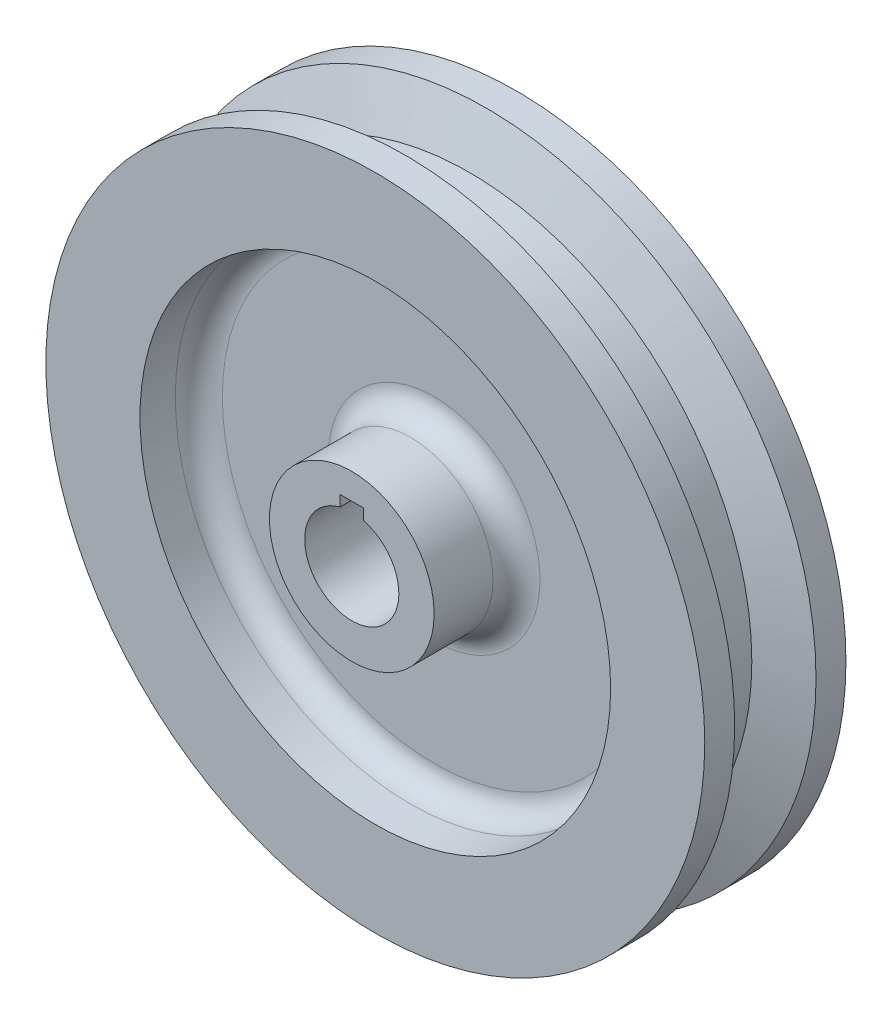
ISO-10303-21;
HEADER;
FILE_DESCRIPTION(('STEP AP214'),'2;1');
FILE_NAME('part.step','',(''),(''),'','','');
FILE_SCHEMA(('AUTOMOTIVE_DESIGN { 1 0 10303 214 1 1 1 1 }'));
ENDSEC;
DATA;
#1=APPLICATION_CONTEXT('core data for automotive mechanical design processes');
#2=APPLICATION_PROTOCOL_DEFINITION('international standard','automotive_design',2000,#1);
#3=PRODUCT_CONTEXT('',#1,'mechanical');
#4=PRODUCT('Part','Part','',(#3));
#5=PRODUCT_RELATED_PRODUCT_CATEGORY('part','',(#4));
#6=PRODUCT_DEFINITION_FORMATION('','',#4);
#7=PRODUCT_DEFINITION_CONTEXT('part definition',#1,'design');
#8=PRODUCT_DEFINITION('design','',#6,#7);
#9=PRODUCT_DEFINITION_SHAPE('','',#8);
#10=(LENGTH_UNIT() NAMED_UNIT(*) SI_UNIT(.MILLI.,.METRE.));
#11=(NAMED_UNIT(*) PLANE_ANGLE_UNIT() SI_UNIT($,.RADIAN.));
#12=(NAMED_UNIT(*) SI_UNIT($,.STERADIAN.) SOLID_ANGLE_UNIT());
#13=UNCERTAINTY_MEASURE_WITH_UNIT(LENGTH_MEASURE(1.E-05),#10,'distance_accuracy_value','');
#14=(GEOMETRIC_REPRESENTATION_CONTEXT(3) GLOBAL_UNCERTAINTY_ASSIGNED_CONTEXT((#13)) GLOBAL_UNIT_ASSIGNED_CONTEXT((#10,
#11,#12)) REPRESENTATION_CONTEXT('',''));
#15=CARTESIAN_POINT('',(0.,0.,0.));
#16=DIRECTION('',(0.,0.,1.));
#17=DIRECTION('',(1.,0.,0.));
#18=AXIS2_PLACEMENT_3D('',#15,#16,#17);
#19=CARTESIAN_POINT('',(0.,0.875000000000003,1.));
#20=DIRECTION('',(0.,0.,-1.));
#21=DIRECTION('',(-1.,0.,0.));
#22=AXIS2_PLACEMENT_3D('',#19,#20,#21);
#23=PLANE('',#22);
#24=CARTESIAN_POINT('',(0.,0.,1.));
#25=DIRECTION('',(0.,0.,1.));
#26=DIRECTION('',(1.,0.,0.));
#27=AXIS2_PLACEMENT_3D('',#24,#25,#26);
#28=CIRCLE('',#27,0.500000000000003);
#29=CARTESIAN_POINT('',(-0.125,0.48412291827593,1.));
#30=VERTEX_POINT('',#29);
#31=CARTESIAN_POINT('',(0.125,0.48412291827593,1.));
#32=VERTEX_POINT('',#31);
#33=EDGE_CURVE('E159',#30,#32,#28,.T.);
#34=ORIENTED_EDGE('',*,*,#33,.F.);
#35=DIRECTION('',(0.,-1.,0.));
#36=VECTOR('',#35,1.);
#37=CARTESIAN_POINT('',(-0.125,0.6,1.));
#38=LINE('',#37,#36);
#39=CARTESIAN_POINT('',(-0.125,0.6,1.));
#40=VERTEX_POINT('',#39);
#41=EDGE_CURVE('E103',#40,#30,#38,.T.);
#42=ORIENTED_EDGE('',*,*,#41,.F.);
#43=DIRECTION('',(-1.,0.,0.));
#44=VECTOR('',#43,1.);
#45=CARTESIAN_POINT('',(-0.125,0.6,1.));
#46=LINE('',#45,#44);
#47=CARTESIAN_POINT('',(0.125,0.6,1.));
#48=VERTEX_POINT('',#47);
#49=EDGE_CURVE('E84',#48,#40,#46,.T.);
#50=ORIENTED_EDGE('',*,*,#49,.F.);
#51=DIRECTION('',(0.,1.,0.));
#52=VECTOR('',#51,1.);
#53=CARTESIAN_POINT('',(0.125,0.6,1.));
#54=LINE('',#53,#52);
#55=EDGE_CURVE('E106',#32,#48,#54,.T.);
#56=ORIENTED_EDGE('',*,*,#55,.F.);
#57=EDGE_LOOP('',(#34,#42,#50,#56));
#58=FACE_BOUND('',#57,.T.);
#59=CARTESIAN_POINT('',(0.,0.,1.));
#60=DIRECTION('',(0.,0.,1.));
#61=DIRECTION('',(1.,0.,0.));
#62=AXIS2_PLACEMENT_3D('',#59,#60,#61);
#63=CIRCLE('',#62,0.875000000000003);
#64=CARTESIAN_POINT('',(0.875000000000003,0.,1.));
#65=VERTEX_POINT('',#64);
#66=EDGE_CURVE('E116',#65,#65,#63,.T.);
#67=ORIENTED_EDGE('',*,*,#66,.T.);
#68=EDGE_LOOP('',(#67));
#69=FACE_BOUND('',#68,.T.);
#70=ADVANCED_FACE('F39',(#58,#69),#23,.F.);
#71=CARTESIAN_POINT('',(0.,0.,48.3797030390739));
#72=DIRECTION('',(0.,0.,1.));
#73=DIRECTION('',(1.,0.,0.));
#74=AXIS2_PLACEMENT_3D('',#71,#72,#73);
#75=CYLINDRICAL_SURFACE('',#74,0.500000000000003);
#76=CARTESIAN_POINT('',(0.,0.,-1.));
#77=DIRECTION('',(0.,0.,1.));
#78=DIRECTION('',(1.,0.,0.));
#79=AXIS2_PLACEMENT_3D('',#76,#77,#78);
#80=CIRCLE('',#79,0.500000000000003);
#81=CARTESIAN_POINT('',(-0.125,0.48412291827593,-1.));
#82=VERTEX_POINT('',#81);
#83=CARTESIAN_POINT('',(0.125,0.48412291827593,-1.));
#84=VERTEX_POINT('',#83);
#85=EDGE_CURVE('E156',#82,#84,#80,.T.);
#86=ORIENTED_EDGE('',*,*,#85,.F.);
#87=DIRECTION('',(0.,0.,1.));
#88=VECTOR('',#87,1.);
#89=CARTESIAN_POINT('',(-0.125,0.48412291827593,48.3797030390739));
#90=LINE('',#89,#88);
#91=EDGE_CURVE('E63',#82,#30,#90,.T.);
#92=ORIENTED_EDGE('',*,*,#91,.T.);
#93=ORIENTED_EDGE('',*,*,#33,.T.);
#94=DIRECTION('',(0.,0.,1.));
#95=VECTOR('',#94,1.);
#96=CARTESIAN_POINT('',(0.125,0.48412291827593,48.3797030390739));
#97=LINE('',#96,#95);
#98=EDGE_CURVE('E87',#32,#84,#97,.F.);
#99=ORIENTED_EDGE('',*,*,#98,.T.);
#100=EDGE_LOOP('',(#86,#92,#93,#99));
#101=FACE_BOUND('',#100,.T.);
#102=ADVANCED_FACE('F217',(#101),#75,.F.);
#103=CARTESIAN_POINT('',(0.,0.500000000000003,-1.));
#104=DIRECTION('',(0.,0.,1.));
#105=DIRECTION('',(1.,0.,0.));
#106=AXIS2_PLACEMENT_3D('',#103,#104,#105);
#107=PLANE('',#106);
#108=CARTESIAN_POINT('',(0.,0.,-1.));
#109=DIRECTION('',(0.,0.,1.));
#110=DIRECTION('',(1.,0.,0.));
#111=AXIS2_PLACEMENT_3D('',#108,#109,#110);
#112=CIRCLE('',#111,0.875000000000003);
#113=CARTESIAN_POINT('',(0.875000000000003,0.,-1.));
#114=VERTEX_POINT('',#113);
#115=EDGE_CURVE('E152',#114,#114,#112,.T.);
#116=ORIENTED_EDGE('',*,*,#115,.F.);
#117=EDGE_LOOP('',(#116));
#118=FACE_BOUND('',#117,.T.);
#119=DIRECTION('',(-1.,0.,0.));
#120=VECTOR('',#119,1.);
#121=CARTESIAN_POINT('',(-0.125,0.6,-1.));
#122=LINE('',#121,#120);
#123=CARTESIAN_POINT('',(0.125,0.6,-1.));
#124=VERTEX_POINT('',#123);
#125=CARTESIAN_POINT('',(-0.125,0.6,-1.));
#126=VERTEX_POINT('',#125);
#127=EDGE_CURVE('E55',#124,#126,#122,.T.);
#128=ORIENTED_EDGE('',*,*,#127,.T.);
#129=DIRECTION('',(0.,-1.,0.));
#130=VECTOR('',#129,1.);
#131=CARTESIAN_POINT('',(-0.125,0.6,-1.));
#132=LINE('',#131,#130);
#133=EDGE_CURVE('E90',#126,#82,#132,.T.);
#134=ORIENTED_EDGE('',*,*,#133,.T.);
#135=ORIENTED_EDGE('',*,*,#85,.T.);
#136=DIRECTION('',(0.,1.,0.));
#137=VECTOR('',#136,1.);
#138=CARTESIAN_POINT('',(0.125,0.500000000000003,-1.));
#139=LINE('',#138,#137);
#140=EDGE_CURVE('E11',#84,#124,#139,.T.);
#141=ORIENTED_EDGE('',*,*,#140,.T.);
#142=EDGE_LOOP('',(#128,#134,#135,#141));
#143=FACE_BOUND('',#142,.T.);
#144=ADVANCED_FACE('F97',(#118,#143),#107,.F.);
#145=CARTESIAN_POINT('',(0.,0.,48.3797030390739));
#146=DIRECTION('',(0.,0.,1.));
#147=DIRECTION('',(1.,0.,0.));
#148=AXIS2_PLACEMENT_3D('',#145,#146,#147);
#149=CYLINDRICAL_SURFACE('',#148,0.875000000000002);
#150=CARTESIAN_POINT('',(0.,0.,-0.375));
#151=DIRECTION('',(0.,0.,1.));
#152=DIRECTION('',(1.,0.,0.));
#153=AXIS2_PLACEMENT_3D('',#150,#151,#152);
#154=CIRCLE('',#153,0.875000000000002);
#155=CARTESIAN_POINT('',(0.875000000000002,0.,-0.375));
#156=VERTEX_POINT('',#155);
#157=EDGE_CURVE('E171',#156,#156,#154,.F.);
#158=ORIENTED_EDGE('',*,*,#157,.T.);
#159=EDGE_LOOP('',(#158));
#160=FACE_BOUND('',#159,.T.);
#161=ORIENTED_EDGE('',*,*,#115,.T.);
#162=EDGE_LOOP('',(#161));
#163=FACE_BOUND('',#162,.T.);
#164=ADVANCED_FACE('F385',(#160,#163),#149,.T.);
#165=CARTESIAN_POINT('',(0.,0.875,-0.125));
#166=DIRECTION('',(0.,0.,1.));
#167=DIRECTION('',(1.,0.,0.));
#168=AXIS2_PLACEMENT_3D('',#165,#166,#167);
#169=PLANE('',#168);
#170=CARTESIAN_POINT('',(0.,0.,-0.125));
#171=DIRECTION('',(0.,0.,1.));
#172=DIRECTION('',(1.,0.,0.));
#173=AXIS2_PLACEMENT_3D('',#170,#171,#172);
#174=CIRCLE('',#173,1.125);
#175=CARTESIAN_POINT('',(1.125,0.,-0.125));
#176=VERTEX_POINT('',#175);
#177=EDGE_CURVE('E167',#176,#176,#174,.T.);
#178=ORIENTED_EDGE('',*,*,#177,.T.);
#179=EDGE_LOOP('',(#178));
#180=FACE_BOUND('',#179,.T.);
#181=CARTESIAN_POINT('',(0.,0.,-0.125));
#182=DIRECTION('',(0.,0.,1.));
#183=DIRECTION('',(1.,0.,0.));
#184=AXIS2_PLACEMENT_3D('',#181,#182,#183);
#185=CIRCLE('',#184,2.25);
#186=CARTESIAN_POINT('',(2.25,0.,-0.125));
#187=VERTEX_POINT('',#186);
#188=EDGE_CURVE('E163',#187,#187,#185,.F.);
#189=ORIENTED_EDGE('',*,*,#188,.T.);
#190=EDGE_LOOP('',(#189));
#191=FACE_BOUND('',#190,.T.);
#192=ADVANCED_FACE('F376',(#180,#191),#169,.F.);
#193=CARTESIAN_POINT('',(0.,0.,48.3797030390739));
#194=DIRECTION('',(0.,0.,1.));
#195=DIRECTION('',(1.,0.,0.));
#196=AXIS2_PLACEMENT_3D('',#193,#194,#195);
#197=CYLINDRICAL_SURFACE('',#196,2.5);
#198=CARTESIAN_POINT('',(0.,0.,-0.375));
#199=DIRECTION('',(0.,0.,1.));
#200=DIRECTION('',(1.,0.,0.));
#201=AXIS2_PLACEMENT_3D('',#198,#199,#200);
#202=CIRCLE('',#201,2.5);
#203=CARTESIAN_POINT('',(2.5,0.,-0.375));
#204=VERTEX_POINT('',#203);
#205=EDGE_CURVE('E175',#204,#204,#202,.T.);
#206=ORIENTED_EDGE('',*,*,#205,.T.);
#207=EDGE_LOOP('',(#206));
#208=FACE_BOUND('',#207,.T.);
#209=CARTESIAN_POINT('',(0.,0.,-0.750000000000001));
#210=DIRECTION('',(0.,0.,1.));
#211=DIRECTION('',(1.,0.,0.));
#212=AXIS2_PLACEMENT_3D('',#209,#210,#211);
#213=CIRCLE('',#212,2.5);
#214=CARTESIAN_POINT('',(2.5,0.,-0.750000000000001));
#215=VERTEX_POINT('',#214);
#216=EDGE_CURVE('E148',#215,#215,#213,.T.);
#217=ORIENTED_EDGE('',*,*,#216,.F.);
#218=EDGE_LOOP('',(#217));
#219=FACE_BOUND('',#218,.T.);
#220=ADVANCED_FACE('F368',(#208,#219),#197,.F.);
#221=CARTESIAN_POINT('',(0.,2.5,-0.75));
#222=DIRECTION('',(0.,0.,1.));
#223=DIRECTION('',(1.,0.,0.));
#224=AXIS2_PLACEMENT_3D('',#221,#222,#223);
#225=PLANE('',#224);
#226=CARTESIAN_POINT('',(0.,0.,-0.750000000000001));
#227=DIRECTION('',(0.,0.,1.));
#228=DIRECTION('',(1.,0.,0.));
#229=AXIS2_PLACEMENT_3D('',#226,#227,#228);
#230=CIRCLE('',#229,3.5);
#231=CARTESIAN_POINT('',(3.5,0.,-0.750000000000001));
#232=VERTEX_POINT('',#231);
#233=EDGE_CURVE('E144',#232,#232,#230,.T.);
#234=ORIENTED_EDGE('',*,*,#233,.F.);
#235=EDGE_LOOP('',(#234));
#236=FACE_BOUND('',#235,.T.);
#237=ORIENTED_EDGE('',*,*,#216,.T.);
#238=EDGE_LOOP('',(#237));
#239=FACE_BOUND('',#238,.T.);
#240=ADVANCED_FACE('F359',(#236,#239),#225,.F.);
#241=CARTESIAN_POINT('',(0.,0.,48.3797030390739));
#242=DIRECTION('',(0.,0.,1.));
#243=DIRECTION('',(1.,0.,0.));
#244=AXIS2_PLACEMENT_3D('',#241,#242,#243);
#245=CYLINDRICAL_SURFACE('',#244,3.5);
#246=CARTESIAN_POINT('',(0.,0.,-0.431985117133098));
#247=DIRECTION('',(0.,0.,1.));
#248=DIRECTION('',(1.,0.,0.));
#249=AXIS2_PLACEMENT_3D('',#246,#247,#248);
#250=CIRCLE('',#249,3.5);
#251=CARTESIAN_POINT('',(3.5,0.,-0.431985117133098));
#252=VERTEX_POINT('',#251);
#253=EDGE_CURVE('E140',#252,#252,#250,.T.);
#254=ORIENTED_EDGE('',*,*,#253,.F.);
#255=EDGE_LOOP('',(#254));
#256=FACE_BOUND('',#255,.T.);
#257=ORIENTED_EDGE('',*,*,#233,.T.);
#258=EDGE_LOOP('',(#257));
#259=FACE_BOUND('',#258,.T.);
#260=ADVANCED_FACE('F350',(#256,#259),#245,.T.);
#261=CARTESIAN_POINT('',(0.,0.,-0.431985117133098));
#262=DIRECTION('',(0.,0.,-1.));
#263=DIRECTION('',(-1.,0.,0.));
#264=AXIS2_PLACEMENT_3D('',#261,#262,#263);
#265=CONICAL_SURFACE('',#264,3.5,1.22173047639604);
#266=CARTESIAN_POINT('',(0.,0.,-0.25));
#267=DIRECTION('',(0.,0.,1.));
#268=DIRECTION('',(1.,0.,0.));
#269=AXIS2_PLACEMENT_3D('',#266,#267,#268);
#270=CIRCLE('',#269,3.);
#271=CARTESIAN_POINT('',(3.,0.,-0.25));
#272=VERTEX_POINT('',#271);
#273=EDGE_CURVE('E136',#272,#272,#270,.T.);
#274=ORIENTED_EDGE('',*,*,#273,.F.);
#275=EDGE_LOOP('',(#274));
#276=FACE_BOUND('',#275,.T.);
#277=ORIENTED_EDGE('',*,*,#253,.T.);
#278=EDGE_LOOP('',(#277));
#279=FACE_BOUND('',#278,.T.);
#280=ADVANCED_FACE('F341',(#276,#279),#265,.T.);
#281=CARTESIAN_POINT('',(0.,0.,48.3797030390739));
#282=DIRECTION('',(0.,0.,1.));
#283=DIRECTION('',(1.,0.,0.));
#284=AXIS2_PLACEMENT_3D('',#281,#282,#283);
#285=CYLINDRICAL_SURFACE('',#284,3.);
#286=CARTESIAN_POINT('',(0.,0.,0.25));
#287=DIRECTION('',(0.,0.,1.));
#288=DIRECTION('',(1.,0.,0.));
#289=AXIS2_PLACEMENT_3D('',#286,#287,#288);
#290=CIRCLE('',#289,3.);
#291=CARTESIAN_POINT('',(3.,0.,0.25));
#292=VERTEX_POINT('',#291);
#293=EDGE_CURVE('E132',#292,#292,#290,.T.);
#294=ORIENTED_EDGE('',*,*,#293,.F.);
#295=EDGE_LOOP('',(#294));
#296=FACE_BOUND('',#295,.T.);
#297=ORIENTED_EDGE('',*,*,#273,.T.);
#298=EDGE_LOOP('',(#297));
#299=FACE_BOUND('',#298,.T.);
#300=ADVANCED_FACE('F332',(#296,#299),#285,.T.);
#301=CARTESIAN_POINT('',(0.,0.,0.25));
#302=DIRECTION('',(0.,0.,1.));
#303=DIRECTION('',(1.,0.,0.));
#304=AXIS2_PLACEMENT_3D('',#301,#302,#303);
#305=CONICAL_SURFACE('',#304,3.,1.22173047639604);
#306=CARTESIAN_POINT('',(0.,0.,0.431985117133098));
#307=DIRECTION('',(0.,0.,1.));
#308=DIRECTION('',(1.,0.,0.));
#309=AXIS2_PLACEMENT_3D('',#306,#307,#308);
#310=CIRCLE('',#309,3.5);
#311=CARTESIAN_POINT('',(3.5,0.,0.431985117133098));
#312=VERTEX_POINT('',#311);
#313=EDGE_CURVE('E128',#312,#312,#310,.T.);
#314=ORIENTED_EDGE('',*,*,#313,.F.);
#315=EDGE_LOOP('',(#314));
#316=FACE_BOUND('',#315,.T.);
#317=ORIENTED_EDGE('',*,*,#293,.T.);
#318=EDGE_LOOP('',(#317));
#319=FACE_BOUND('',#318,.T.);
#320=ADVANCED_FACE('F323',(#316,#319),#305,.T.);
#321=CARTESIAN_POINT('',(0.,0.,48.3797030390739));
#322=DIRECTION('',(0.,0.,1.));
#323=DIRECTION('',(1.,0.,0.));
#324=AXIS2_PLACEMENT_3D('',#321,#322,#323);
#325=CYLINDRICAL_SURFACE('',#324,3.5);
#326=CARTESIAN_POINT('',(0.,0.,0.750000000000001));
#327=DIRECTION('',(0.,0.,1.));
#328=DIRECTION('',(1.,0.,0.));
#329=AXIS2_PLACEMENT_3D('',#326,#327,#328);
#330=CIRCLE('',#329,3.5);
#331=CARTESIAN_POINT('',(3.5,0.,0.750000000000001));
#332=VERTEX_POINT('',#331);
#333=EDGE_CURVE('E124',#332,#332,#330,.T.);
#334=ORIENTED_EDGE('',*,*,#333,.F.);
#335=EDGE_LOOP('',(#334));
#336=FACE_BOUND('',#335,.T.);
#337=ORIENTED_EDGE('',*,*,#313,.T.);
#338=EDGE_LOOP('',(#337));
#339=FACE_BOUND('',#338,.T.);
#340=ADVANCED_FACE('F313',(#336,#339),#325,.T.);
#341=CARTESIAN_POINT('',(0.,3.5,0.75));
#342=DIRECTION('',(0.,0.,-1.));
#343=DIRECTION('',(-1.,0.,0.));
#344=AXIS2_PLACEMENT_3D('',#341,#342,#343);
#345=PLANE('',#344);
#346=CARTESIAN_POINT('',(0.,0.,0.750000000000001));
#347=DIRECTION('',(0.,0.,1.));
#348=DIRECTION('',(1.,0.,0.));
#349=AXIS2_PLACEMENT_3D('',#346,#347,#348);
#350=CIRCLE('',#349,2.5);
#351=CARTESIAN_POINT('',(2.5,0.,0.750000000000001));
#352=VERTEX_POINT('',#351);
#353=EDGE_CURVE('E120',#352,#352,#350,.T.);
#354=ORIENTED_EDGE('',*,*,#353,.F.);
#355=EDGE_LOOP('',(#354));
#356=FACE_BOUND('',#355,.T.);
#357=ORIENTED_EDGE('',*,*,#333,.T.);
#358=EDGE_LOOP('',(#357));
#359=FACE_BOUND('',#358,.T.);
#360=ADVANCED_FACE('F214',(#356,#359),#345,.F.);
#361=CARTESIAN_POINT('',(0.,0.,48.3797030390739));
#362=DIRECTION('',(0.,0.,1.));
#363=DIRECTION('',(1.,0.,0.));
#364=AXIS2_PLACEMENT_3D('',#361,#362,#363);
#365=CYLINDRICAL_SURFACE('',#364,2.5);
#366=CARTESIAN_POINT('',(0.,0.,0.375));
#367=DIRECTION('',(0.,0.,-1.));
#368=DIRECTION('',(-1.,0.,0.));
#369=AXIS2_PLACEMENT_3D('',#366,#367,#368);
#370=CIRCLE('',#369,2.5);
#371=CARTESIAN_POINT('',(-2.5,0.,0.375));
#372=VERTEX_POINT('',#371);
#373=EDGE_CURVE('E48',#372,#372,#370,.T.);
#374=ORIENTED_EDGE('',*,*,#373,.T.);
#375=EDGE_LOOP('',(#374));
#376=FACE_BOUND('',#375,.T.);
#377=ORIENTED_EDGE('',*,*,#353,.T.);
#378=EDGE_LOOP('',(#377));
#379=FACE_BOUND('',#378,.T.);
#380=ADVANCED_FACE('F194',(#376,#379),#365,.F.);
#381=CARTESIAN_POINT('',(0.,2.5,0.125));
#382=DIRECTION('',(0.,0.,-1.));
#383=DIRECTION('',(-1.,0.,0.));
#384=AXIS2_PLACEMENT_3D('',#381,#382,#383);
#385=PLANE('',#384);
#386=CARTESIAN_POINT('',(0.,0.,0.125));
#387=DIRECTION('',(0.,0.,-1.));
#388=DIRECTION('',(-1.,0.,0.));
#389=AXIS2_PLACEMENT_3D('',#386,#387,#388);
#390=CIRCLE('',#389,1.125);
#391=CARTESIAN_POINT('',(-1.125,0.,0.125));
#392=VERTEX_POINT('',#391);
#393=EDGE_CURVE('E187',#392,#392,#390,.T.);
#394=ORIENTED_EDGE('',*,*,#393,.T.);
#395=EDGE_LOOP('',(#394));
#396=FACE_BOUND('',#395,.T.);
#397=CARTESIAN_POINT('',(0.,0.,0.125));
#398=DIRECTION('',(0.,0.,-1.));
#399=DIRECTION('',(-1.,0.,0.));
#400=AXIS2_PLACEMENT_3D('',#397,#398,#399);
#401=CIRCLE('',#400,2.25);
#402=CARTESIAN_POINT('',(-2.25,0.,0.125));
#403=VERTEX_POINT('',#402);
#404=EDGE_CURVE('E183',#403,#403,#401,.F.);
#405=ORIENTED_EDGE('',*,*,#404,.T.);
#406=EDGE_LOOP('',(#405));
#407=FACE_BOUND('',#406,.T.);
#408=ADVANCED_FACE('F202',(#396,#407),#385,.F.);
#409=CARTESIAN_POINT('',(0.,0.,48.3797030390739));
#410=DIRECTION('',(0.,0.,1.));
#411=DIRECTION('',(1.,0.,0.));
#412=AXIS2_PLACEMENT_3D('',#409,#410,#411);
#413=CYLINDRICAL_SURFACE('',#412,0.875000000000001);
#414=CARTESIAN_POINT('',(0.,0.,0.375));
#415=DIRECTION('',(0.,0.,-1.));
#416=DIRECTION('',(-1.,0.,0.));
#417=AXIS2_PLACEMENT_3D('',#414,#415,#416);
#418=CIRCLE('',#417,0.875000000000001);
#419=CARTESIAN_POINT('',(-0.875000000000001,0.,0.375));
#420=VERTEX_POINT('',#419);
#421=EDGE_CURVE('E179',#420,#420,#418,.F.);
#422=ORIENTED_EDGE('',*,*,#421,.T.);
#423=EDGE_LOOP('',(#422));
#424=FACE_BOUND('',#423,.T.);
#425=ORIENTED_EDGE('',*,*,#66,.F.);
#426=EDGE_LOOP('',(#425));
#427=FACE_BOUND('',#426,.T.);
#428=ADVANCED_FACE('F204',(#424,#427),#413,.T.);
#429=CARTESIAN_POINT('',(0.,0.,-0.375));
#430=DIRECTION('',(0.,0.,1.));
#431=DIRECTION('',(1.,0.,0.));
#432=AXIS2_PLACEMENT_3D('',#429,#430,#431);
#433=TOROIDAL_SURFACE('',#432,1.125,0.25);
#434=ORIENTED_EDGE('',*,*,#157,.F.);
#435=EDGE_LOOP('',(#434));
#436=FACE_BOUND('',#435,.T.);
#437=ORIENTED_EDGE('',*,*,#177,.F.);
#438=EDGE_LOOP('',(#437));
#439=FACE_BOUND('',#438,.T.);
#440=ADVANCED_FACE('F211',(#436,#439),#433,.F.);
#441=CARTESIAN_POINT('',(0.,0.,-0.375));
#442=DIRECTION('',(0.,0.,1.));
#443=DIRECTION('',(1.,0.,0.));
#444=AXIS2_PLACEMENT_3D('',#441,#442,#443);
#445=TOROIDAL_SURFACE('',#444,2.25,0.25);
#446=ORIENTED_EDGE('',*,*,#188,.F.);
#447=EDGE_LOOP('',(#446));
#448=FACE_BOUND('',#447,.T.);
#449=ORIENTED_EDGE('',*,*,#205,.F.);
#450=EDGE_LOOP('',(#449));
#451=FACE_BOUND('',#450,.T.);
#452=ADVANCED_FACE('F231',(#448,#451),#445,.F.);
#453=CARTESIAN_POINT('',(0.,0.,0.375));
#454=DIRECTION('',(0.,0.,-1.));
#455=DIRECTION('',(-1.,0.,0.));
#456=AXIS2_PLACEMENT_3D('',#453,#454,#455);
#457=TOROIDAL_SURFACE('',#456,1.125,0.25);
#458=ORIENTED_EDGE('',*,*,#393,.F.);
#459=EDGE_LOOP('',(#458));
#460=FACE_BOUND('',#459,.T.);
#461=ORIENTED_EDGE('',*,*,#421,.F.);
#462=EDGE_LOOP('',(#461));
#463=FACE_BOUND('',#462,.T.);
#464=ADVANCED_FACE('F199',(#460,#463),#457,.F.);
#465=CARTESIAN_POINT('',(0.,0.,0.375));
#466=DIRECTION('',(0.,0.,-1.));
#467=DIRECTION('',(-1.,0.,0.));
#468=AXIS2_PLACEMENT_3D('',#465,#466,#467);
#469=TOROIDAL_SURFACE('',#468,2.25,0.25);
#470=ORIENTED_EDGE('',*,*,#373,.F.);
#471=EDGE_LOOP('',(#470));
#472=FACE_BOUND('',#471,.T.);
#473=ORIENTED_EDGE('',*,*,#404,.F.);
#474=EDGE_LOOP('',(#473));
#475=FACE_BOUND('',#474,.T.);
#476=ADVANCED_FACE('F41',(#472,#475),#469,.F.);
#477=CARTESIAN_POINT('',(-0.125,0.6,-1.));
#478=DIRECTION('',(-1.,0.,0.));
#479=DIRECTION('',(0.,-1.,0.));
#480=AXIS2_PLACEMENT_3D('',#477,#478,#479);
#481=PLANE('',#480);
#482=ORIENTED_EDGE('',*,*,#133,.F.);
#483=DIRECTION('',(0.,0.,1.));
#484=VECTOR('',#483,1.);
#485=CARTESIAN_POINT('',(-0.125,0.6,-1.));
#486=LINE('',#485,#484);
#487=EDGE_CURVE('E81',#126,#40,#486,.T.);
#488=ORIENTED_EDGE('',*,*,#487,.T.);
#489=ORIENTED_EDGE('',*,*,#41,.T.);
#490=ORIENTED_EDGE('',*,*,#91,.F.);
#491=EDGE_LOOP('',(#482,#488,#489,#490));
#492=FACE_BOUND('',#491,.T.);
#493=ADVANCED_FACE('F91',(#492),#481,.F.);
#494=CARTESIAN_POINT('',(0.125,0.6,-1.));
#495=DIRECTION('',(1.,0.,0.));
#496=DIRECTION('',(0.,1.,0.));
#497=AXIS2_PLACEMENT_3D('',#494,#495,#496);
#498=PLANE('',#497);
#499=ORIENTED_EDGE('',*,*,#55,.T.);
#500=DIRECTION('',(0.,0.,1.));
#501=VECTOR('',#500,1.);
#502=CARTESIAN_POINT('',(0.125,0.6,-1.));
#503=LINE('',#502,#501);
#504=EDGE_CURVE('E88',#124,#48,#503,.T.);
#505=ORIENTED_EDGE('',*,*,#504,.F.);
#506=ORIENTED_EDGE('',*,*,#140,.F.);
#507=ORIENTED_EDGE('',*,*,#98,.F.);
#508=EDGE_LOOP('',(#499,#505,#506,#507));
#509=FACE_BOUND('',#508,.T.);
#510=ADVANCED_FACE('F256',(#509),#498,.F.);
#511=CARTESIAN_POINT('',(-0.125,0.6,-1.));
#512=DIRECTION('',(0.,1.,0.));
#513=DIRECTION('',(0.,0.,1.));
#514=AXIS2_PLACEMENT_3D('',#511,#512,#513);
#515=PLANE('',#514);
#516=ORIENTED_EDGE('',*,*,#49,.T.);
#517=ORIENTED_EDGE('',*,*,#487,.F.);
#518=ORIENTED_EDGE('',*,*,#127,.F.);
#519=ORIENTED_EDGE('',*,*,#504,.T.);
#520=EDGE_LOOP('',(#516,#517,#518,#519));
#521=FACE_BOUND('',#520,.T.);
#522=ADVANCED_FACE('F82',(#521),#515,.F.);
#523=CLOSED_SHELL('',(#70,#102,#144,#164,#192,#220,#240,#260,#280,#300,#320,#340,#360,#380,#408,
#428,#440,#452,#464,#476,#493,#510,#522));
#524=MANIFOLD_SOLID_BREP('B2',#523);
#525=ADVANCED_BREP_SHAPE_REPRESENTATION('',(#18,#524),#14);
#526=SHAPE_DEFINITION_REPRESENTATION(#9,#525);
ENDSEC;
END-ISO-10303-21;
